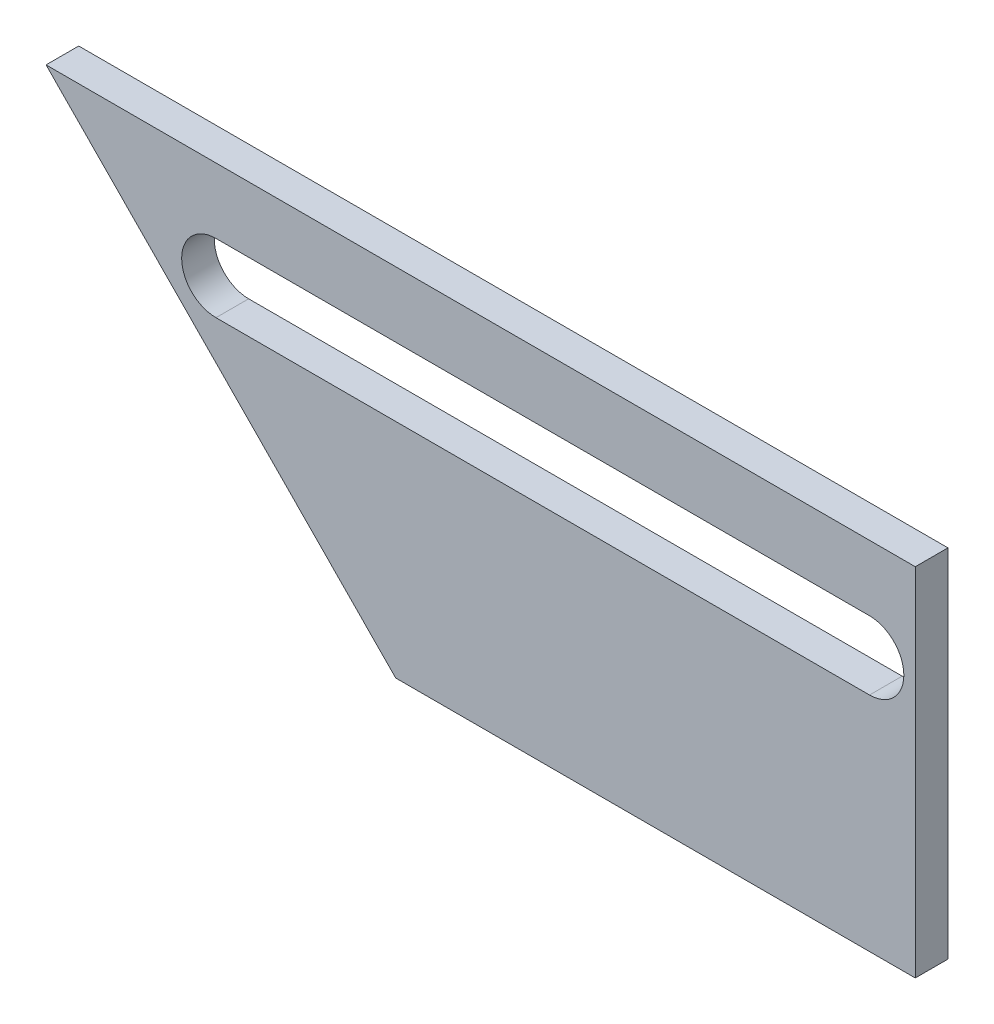
ISO-10303-21;
HEADER;
FILE_DESCRIPTION(('STEP AP214'),'2;1');
FILE_NAME('part.step','',(''),(''),'','','');
FILE_SCHEMA(('AUTOMOTIVE_DESIGN { 1 0 10303 214 1 1 1 1 }'));
ENDSEC;
DATA;
#1=APPLICATION_CONTEXT('core data for automotive mechanical design processes');
#2=APPLICATION_PROTOCOL_DEFINITION('international standard','automotive_design',2000,#1);
#3=PRODUCT_CONTEXT('',#1,'mechanical');
#4=PRODUCT('Part','Part','',(#3));
#5=PRODUCT_RELATED_PRODUCT_CATEGORY('part','',(#4));
#6=PRODUCT_DEFINITION_FORMATION('','',#4);
#7=PRODUCT_DEFINITION_CONTEXT('part definition',#1,'design');
#8=PRODUCT_DEFINITION('design','',#6,#7);
#9=PRODUCT_DEFINITION_SHAPE('','',#8);
#10=(LENGTH_UNIT() NAMED_UNIT(*) SI_UNIT(.MILLI.,.METRE.));
#11=(NAMED_UNIT(*) PLANE_ANGLE_UNIT() SI_UNIT($,.RADIAN.));
#12=(NAMED_UNIT(*) SI_UNIT($,.STERADIAN.) SOLID_ANGLE_UNIT());
#13=UNCERTAINTY_MEASURE_WITH_UNIT(LENGTH_MEASURE(1.E-05),#10,'distance_accuracy_value','');
#14=(GEOMETRIC_REPRESENTATION_CONTEXT(3) GLOBAL_UNCERTAINTY_ASSIGNED_CONTEXT((#13)) GLOBAL_UNIT_ASSIGNED_CONTEXT((#10,
#11,#12)) REPRESENTATION_CONTEXT('',''));
#15=CARTESIAN_POINT('',(0.,0.,0.));
#16=DIRECTION('',(0.,0.,1.));
#17=DIRECTION('',(1.,0.,0.));
#18=AXIS2_PLACEMENT_3D('',#15,#16,#17);
#19=CARTESIAN_POINT('',(0.,0.,5.));
#20=DIRECTION('',(0.,0.,1.));
#21=DIRECTION('',(1.,0.,0.));
#22=AXIS2_PLACEMENT_3D('',#19,#20,#21);
#23=PLANE('',#22);
#24=DIRECTION('',(1.,0.,0.));
#25=VECTOR('',#24,1.);
#26=CARTESIAN_POINT('',(-79.5,0.,5.));
#27=LINE('',#26,#25);
#28=CARTESIAN_POINT('',(-79.5,0.,5.));
#29=VERTEX_POINT('',#28);
#30=CARTESIAN_POINT('',(0.,0.,5.));
#31=VERTEX_POINT('',#30);
#32=EDGE_CURVE('E138',#29,#31,#27,.T.);
#33=ORIENTED_EDGE('',*,*,#32,.T.);
#34=DIRECTION('',(0.,1.,0.));
#35=VECTOR('',#34,1.);
#36=CARTESIAN_POINT('',(0.,0.,5.));
#37=LINE('',#36,#35);
#38=CARTESIAN_POINT('',(0.,54.5,5.));
#39=VERTEX_POINT('',#38);
#40=EDGE_CURVE('E141',#31,#39,#37,.T.);
#41=ORIENTED_EDGE('',*,*,#40,.T.);
#42=DIRECTION('',(-1.,0.,0.));
#43=VECTOR('',#42,1.);
#44=CARTESIAN_POINT('',(0.,54.5,5.));
#45=LINE('',#44,#43);
#46=CARTESIAN_POINT('',(-133.,54.5,5.));
#47=VERTEX_POINT('',#46);
#48=EDGE_CURVE('E144',#39,#47,#45,.T.);
#49=ORIENTED_EDGE('',*,*,#48,.T.);
#50=DIRECTION('',(0.700529467263819,-0.713623475997721,0.));
#51=VECTOR('',#50,1.);
#52=CARTESIAN_POINT('',(-133.,54.5,5.));
#53=LINE('',#52,#51);
#54=EDGE_CURVE('E146',#47,#29,#53,.T.);
#55=ORIENTED_EDGE('',*,*,#54,.T.);
#56=EDGE_LOOP('',(#33,#41,#49,#55));
#57=FACE_BOUND('',#56,.T.);
#58=DIRECTION('',(1.,0.,0.));
#59=VECTOR('',#58,1.);
#60=CARTESIAN_POINT('',(-107.,34.,5.));
#61=LINE('',#60,#59);
#62=CARTESIAN_POINT('',(-107.,34.,5.));
#63=VERTEX_POINT('',#62);
#64=CARTESIAN_POINT('',(-7.,34.,5.));
#65=VERTEX_POINT('',#64);
#66=EDGE_CURVE('E110',#63,#65,#61,.T.);
#67=ORIENTED_EDGE('',*,*,#66,.F.);
#68=CARTESIAN_POINT('',(-107.,39.25,5.));
#69=DIRECTION('',(0.,0.,1.));
#70=DIRECTION('',(1.,0.,0.));
#71=AXIS2_PLACEMENT_3D('',#68,#69,#70);
#72=CIRCLE('',#71,5.24999999999999);
#73=CARTESIAN_POINT('',(-107.,44.5,5.));
#74=VERTEX_POINT('',#73);
#75=EDGE_CURVE('E102',#74,#63,#72,.T.);
#76=ORIENTED_EDGE('',*,*,#75,.F.);
#77=DIRECTION('',(-1.,0.,0.));
#78=VECTOR('',#77,1.);
#79=CARTESIAN_POINT('',(-107.,44.5,5.));
#80=LINE('',#79,#78);
#81=CARTESIAN_POINT('',(-7.,44.5,5.));
#82=VERTEX_POINT('',#81);
#83=EDGE_CURVE('E124',#82,#74,#80,.T.);
#84=ORIENTED_EDGE('',*,*,#83,.F.);
#85=CARTESIAN_POINT('',(-7.,39.25,5.));
#86=DIRECTION('',(0.,0.,1.));
#87=DIRECTION('',(1.,0.,0.));
#88=AXIS2_PLACEMENT_3D('',#85,#86,#87);
#89=CIRCLE('',#88,5.24999999999999);
#90=EDGE_CURVE('E122',#65,#82,#89,.T.);
#91=ORIENTED_EDGE('',*,*,#90,.F.);
#92=EDGE_LOOP('',(#67,#76,#84,#91));
#93=FACE_BOUND('',#92,.T.);
#94=ADVANCED_FACE('F37',(#57,#93),#23,.T.);
#95=CARTESIAN_POINT('',(0.,0.,0.));
#96=DIRECTION('',(0.,0.,1.));
#97=DIRECTION('',(1.,0.,0.));
#98=AXIS2_PLACEMENT_3D('',#95,#96,#97);
#99=PLANE('',#98);
#100=DIRECTION('',(1.,0.,0.));
#101=VECTOR('',#100,1.);
#102=CARTESIAN_POINT('',(-79.5,0.,0.));
#103=LINE('',#102,#101);
#104=CARTESIAN_POINT('',(-79.5,0.,0.));
#105=VERTEX_POINT('',#104);
#106=CARTESIAN_POINT('',(0.,0.,0.));
#107=VERTEX_POINT('',#106);
#108=EDGE_CURVE('E118',#105,#107,#103,.T.);
#109=ORIENTED_EDGE('',*,*,#108,.F.);
#110=DIRECTION('',(0.700529467263819,-0.713623475997721,0.));
#111=VECTOR('',#110,1.);
#112=CARTESIAN_POINT('',(-133.,54.5,0.));
#113=LINE('',#112,#111);
#114=CARTESIAN_POINT('',(-133.,54.5,0.));
#115=VERTEX_POINT('',#114);
#116=EDGE_CURVE('E142',#115,#105,#113,.T.);
#117=ORIENTED_EDGE('',*,*,#116,.F.);
#118=DIRECTION('',(-1.,0.,0.));
#119=VECTOR('',#118,1.);
#120=CARTESIAN_POINT('',(0.,54.5,0.));
#121=LINE('',#120,#119);
#122=CARTESIAN_POINT('',(0.,54.5,0.));
#123=VERTEX_POINT('',#122);
#124=EDGE_CURVE('E153',#123,#115,#121,.T.);
#125=ORIENTED_EDGE('',*,*,#124,.F.);
#126=DIRECTION('',(0.,1.,0.));
#127=VECTOR('',#126,1.);
#128=CARTESIAN_POINT('',(0.,0.,0.));
#129=LINE('',#128,#127);
#130=EDGE_CURVE('E151',#107,#123,#129,.T.);
#131=ORIENTED_EDGE('',*,*,#130,.F.);
#132=EDGE_LOOP('',(#109,#117,#125,#131));
#133=FACE_BOUND('',#132,.T.);
#134=CARTESIAN_POINT('',(-107.,39.25,0.));
#135=DIRECTION('',(0.,0.,1.));
#136=DIRECTION('',(1.,0.,0.));
#137=AXIS2_PLACEMENT_3D('',#134,#135,#136);
#138=CIRCLE('',#137,5.24999999999999);
#139=CARTESIAN_POINT('',(-107.,44.5,0.));
#140=VERTEX_POINT('',#139);
#141=CARTESIAN_POINT('',(-107.,34.,0.));
#142=VERTEX_POINT('',#141);
#143=EDGE_CURVE('E60',#140,#142,#138,.T.);
#144=ORIENTED_EDGE('',*,*,#143,.T.);
#145=DIRECTION('',(1.,0.,0.));
#146=VECTOR('',#145,1.);
#147=CARTESIAN_POINT('',(-107.,34.,0.));
#148=LINE('',#147,#146);
#149=CARTESIAN_POINT('',(-7.,34.,0.));
#150=VERTEX_POINT('',#149);
#151=EDGE_CURVE('E117',#142,#150,#148,.T.);
#152=ORIENTED_EDGE('',*,*,#151,.T.);
#153=CARTESIAN_POINT('',(-7.,39.25,0.));
#154=DIRECTION('',(0.,0.,1.));
#155=DIRECTION('',(1.,0.,0.));
#156=AXIS2_PLACEMENT_3D('',#153,#154,#155);
#157=CIRCLE('',#156,5.24999999999999);
#158=CARTESIAN_POINT('',(-7.,44.5,0.));
#159=VERTEX_POINT('',#158);
#160=EDGE_CURVE('E130',#150,#159,#157,.T.);
#161=ORIENTED_EDGE('',*,*,#160,.T.);
#162=DIRECTION('',(-1.,0.,0.));
#163=VECTOR('',#162,1.);
#164=CARTESIAN_POINT('',(-107.,44.5,0.));
#165=LINE('',#164,#163);
#166=EDGE_CURVE('E111',#159,#140,#165,.T.);
#167=ORIENTED_EDGE('',*,*,#166,.T.);
#168=EDGE_LOOP('',(#144,#152,#161,#167));
#169=FACE_BOUND('',#168,.T.);
#170=ADVANCED_FACE('F171',(#133,#169),#99,.F.);
#171=CARTESIAN_POINT('',(-79.5,0.,5.));
#172=DIRECTION('',(0.,1.,0.));
#173=DIRECTION('',(0.,0.,1.));
#174=AXIS2_PLACEMENT_3D('',#171,#172,#173);
#175=PLANE('',#174);
#176=ORIENTED_EDGE('',*,*,#108,.T.);
#177=DIRECTION('',(0.,0.,-1.));
#178=VECTOR('',#177,1.);
#179=CARTESIAN_POINT('',(0.,0.,5.));
#180=LINE('',#179,#178);
#181=EDGE_CURVE('E11',#31,#107,#180,.T.);
#182=ORIENTED_EDGE('',*,*,#181,.F.);
#183=ORIENTED_EDGE('',*,*,#32,.F.);
#184=DIRECTION('',(0.,0.,-1.));
#185=VECTOR('',#184,1.);
#186=CARTESIAN_POINT('',(-79.5,0.,5.));
#187=LINE('',#186,#185);
#188=EDGE_CURVE('E148',#29,#105,#187,.T.);
#189=ORIENTED_EDGE('',*,*,#188,.T.);
#190=EDGE_LOOP('',(#176,#182,#183,#189));
#191=FACE_BOUND('',#190,.T.);
#192=ADVANCED_FACE('F39',(#191),#175,.F.);
#193=CARTESIAN_POINT('',(0.,0.,5.));
#194=DIRECTION('',(-1.,0.,0.));
#195=DIRECTION('',(0.,0.,1.));
#196=AXIS2_PLACEMENT_3D('',#193,#194,#195);
#197=PLANE('',#196);
#198=ORIENTED_EDGE('',*,*,#130,.T.);
#199=DIRECTION('',(0.,0.,-1.));
#200=VECTOR('',#199,1.);
#201=CARTESIAN_POINT('',(0.,54.5,5.));
#202=LINE('',#201,#200);
#203=EDGE_CURVE('E45',#39,#123,#202,.T.);
#204=ORIENTED_EDGE('',*,*,#203,.F.);
#205=ORIENTED_EDGE('',*,*,#40,.F.);
#206=ORIENTED_EDGE('',*,*,#181,.T.);
#207=EDGE_LOOP('',(#198,#204,#205,#206));
#208=FACE_BOUND('',#207,.T.);
#209=ADVANCED_FACE('F181',(#208),#197,.F.);
#210=CARTESIAN_POINT('',(0.,54.5,5.));
#211=DIRECTION('',(0.,-1.,0.));
#212=DIRECTION('',(1.,0.,0.));
#213=AXIS2_PLACEMENT_3D('',#210,#211,#212);
#214=PLANE('',#213);
#215=ORIENTED_EDGE('',*,*,#124,.T.);
#216=DIRECTION('',(0.,0.,-1.));
#217=VECTOR('',#216,1.);
#218=CARTESIAN_POINT('',(-133.,54.5,5.));
#219=LINE('',#218,#217);
#220=EDGE_CURVE('E158',#47,#115,#219,.T.);
#221=ORIENTED_EDGE('',*,*,#220,.F.);
#222=ORIENTED_EDGE('',*,*,#48,.F.);
#223=ORIENTED_EDGE('',*,*,#203,.T.);
#224=EDGE_LOOP('',(#215,#221,#222,#223));
#225=FACE_BOUND('',#224,.T.);
#226=ADVANCED_FACE('F165',(#225),#214,.F.);
#227=CARTESIAN_POINT('',(-133.,54.5,5.));
#228=DIRECTION('',(0.713623475997721,0.700529467263819,0.));
#229=DIRECTION('',(-0.700529467263819,0.713623475997721,0.));
#230=AXIS2_PLACEMENT_3D('',#227,#228,#229);
#231=PLANE('',#230);
#232=ORIENTED_EDGE('',*,*,#116,.T.);
#233=ORIENTED_EDGE('',*,*,#188,.F.);
#234=ORIENTED_EDGE('',*,*,#54,.F.);
#235=ORIENTED_EDGE('',*,*,#220,.T.);
#236=EDGE_LOOP('',(#232,#233,#234,#235));
#237=FACE_BOUND('',#236,.T.);
#238=ADVANCED_FACE('F175',(#237),#231,.F.);
#239=CARTESIAN_POINT('',(-107.,39.25,5.));
#240=DIRECTION('',(0.,0.,-1.));
#241=DIRECTION('',(-1.,0.,0.));
#242=AXIS2_PLACEMENT_3D('',#239,#240,#241);
#243=CYLINDRICAL_SURFACE('',#242,5.24999999999999);
#244=ORIENTED_EDGE('',*,*,#143,.F.);
#245=DIRECTION('',(0.,0.,-1.));
#246=VECTOR('',#245,1.);
#247=CARTESIAN_POINT('',(-107.,44.5,5.));
#248=LINE('',#247,#246);
#249=EDGE_CURVE('E106',#74,#140,#248,.T.);
#250=ORIENTED_EDGE('',*,*,#249,.F.);
#251=ORIENTED_EDGE('',*,*,#75,.T.);
#252=DIRECTION('',(0.,0.,-1.));
#253=VECTOR('',#252,1.);
#254=CARTESIAN_POINT('',(-107.,34.,5.));
#255=LINE('',#254,#253);
#256=EDGE_CURVE('E105',#63,#142,#255,.T.);
#257=ORIENTED_EDGE('',*,*,#256,.T.);
#258=EDGE_LOOP('',(#244,#250,#251,#257));
#259=FACE_BOUND('',#258,.T.);
#260=ADVANCED_FACE('F104',(#259),#243,.F.);
#261=CARTESIAN_POINT('',(-107.,34.,5.));
#262=DIRECTION('',(0.,1.,0.));
#263=DIRECTION('',(0.,0.,1.));
#264=AXIS2_PLACEMENT_3D('',#261,#262,#263);
#265=PLANE('',#264);
#266=ORIENTED_EDGE('',*,*,#151,.F.);
#267=ORIENTED_EDGE('',*,*,#256,.F.);
#268=ORIENTED_EDGE('',*,*,#66,.T.);
#269=DIRECTION('',(0.,0.,-1.));
#270=VECTOR('',#269,1.);
#271=CARTESIAN_POINT('',(-7.,34.,5.));
#272=LINE('',#271,#270);
#273=EDGE_CURVE('E119',#65,#150,#272,.T.);
#274=ORIENTED_EDGE('',*,*,#273,.T.);
#275=EDGE_LOOP('',(#266,#267,#268,#274));
#276=FACE_BOUND('',#275,.T.);
#277=ADVANCED_FACE('F114',(#276),#265,.T.);
#278=CARTESIAN_POINT('',(-7.,39.25,5.));
#279=DIRECTION('',(0.,0.,-1.));
#280=DIRECTION('',(-1.,0.,0.));
#281=AXIS2_PLACEMENT_3D('',#278,#279,#280);
#282=CYLINDRICAL_SURFACE('',#281,5.24999999999999);
#283=ORIENTED_EDGE('',*,*,#160,.F.);
#284=ORIENTED_EDGE('',*,*,#273,.F.);
#285=ORIENTED_EDGE('',*,*,#90,.T.);
#286=DIRECTION('',(0.,0.,-1.));
#287=VECTOR('',#286,1.);
#288=CARTESIAN_POINT('',(-7.,44.5,5.));
#289=LINE('',#288,#287);
#290=EDGE_CURVE('E52',#82,#159,#289,.T.);
#291=ORIENTED_EDGE('',*,*,#290,.T.);
#292=EDGE_LOOP('',(#283,#284,#285,#291));
#293=FACE_BOUND('',#292,.T.);
#294=ADVANCED_FACE('F204',(#293),#282,.F.);
#295=CARTESIAN_POINT('',(-107.,44.5,5.));
#296=DIRECTION('',(0.,-1.,0.));
#297=DIRECTION('',(0.,0.,-1.));
#298=AXIS2_PLACEMENT_3D('',#295,#296,#297);
#299=PLANE('',#298);
#300=ORIENTED_EDGE('',*,*,#166,.F.);
#301=ORIENTED_EDGE('',*,*,#290,.F.);
#302=ORIENTED_EDGE('',*,*,#83,.T.);
#303=ORIENTED_EDGE('',*,*,#249,.T.);
#304=EDGE_LOOP('',(#300,#301,#302,#303));
#305=FACE_BOUND('',#304,.T.);
#306=ADVANCED_FACE('F208',(#305),#299,.T.);
#307=CLOSED_SHELL('',(#94,#170,#192,#209,#226,#238,#260,#277,#294,#306));
#308=MANIFOLD_SOLID_BREP('B2',#307);
#309=ADVANCED_BREP_SHAPE_REPRESENTATION('',(#18,#308),#14);
#310=SHAPE_DEFINITION_REPRESENTATION(#9,#309);
ENDSEC;
END-ISO-10303-21;
